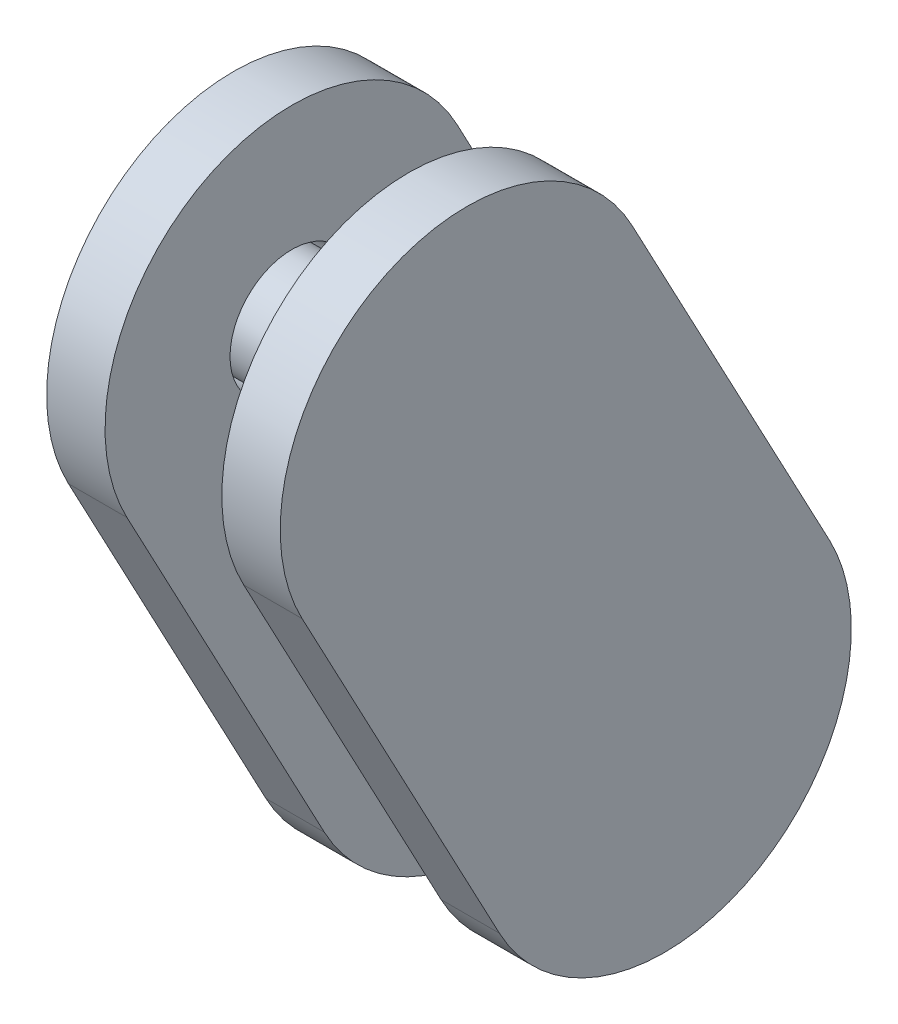
ISO-10303-21;
HEADER;
FILE_DESCRIPTION(('STEP AP214'),'2;1');
FILE_NAME('part.step','',(''),(''),'','','');
FILE_SCHEMA(('AUTOMOTIVE_DESIGN { 1 0 10303 214 1 1 1 1 }'));
ENDSEC;
DATA;
#1=APPLICATION_CONTEXT('core data for automotive mechanical design processes');
#2=APPLICATION_PROTOCOL_DEFINITION('international standard','automotive_design',2000,#1);
#3=PRODUCT_CONTEXT('',#1,'mechanical');
#4=PRODUCT('Part','Part','',(#3));
#5=PRODUCT_RELATED_PRODUCT_CATEGORY('part','',(#4));
#6=PRODUCT_DEFINITION_FORMATION('','',#4);
#7=PRODUCT_DEFINITION_CONTEXT('part definition',#1,'design');
#8=PRODUCT_DEFINITION('design','',#6,#7);
#9=PRODUCT_DEFINITION_SHAPE('','',#8);
#10=(LENGTH_UNIT() NAMED_UNIT(*) SI_UNIT(.MILLI.,.METRE.));
#11=(NAMED_UNIT(*) PLANE_ANGLE_UNIT() SI_UNIT($,.RADIAN.));
#12=(NAMED_UNIT(*) SI_UNIT($,.STERADIAN.) SOLID_ANGLE_UNIT());
#13=UNCERTAINTY_MEASURE_WITH_UNIT(LENGTH_MEASURE(1.E-05),#10,'distance_accuracy_value','');
#14=(GEOMETRIC_REPRESENTATION_CONTEXT(3) GLOBAL_UNCERTAINTY_ASSIGNED_CONTEXT((#13)) GLOBAL_UNIT_ASSIGNED_CONTEXT((#10,
#11,#12)) REPRESENTATION_CONTEXT('',''));
#15=CARTESIAN_POINT('',(0.,0.,0.));
#16=DIRECTION('',(0.,0.,1.));
#17=DIRECTION('',(1.,0.,0.));
#18=AXIS2_PLACEMENT_3D('',#15,#16,#17);
#19=CARTESIAN_POINT('',(-4.99519052838327,0.00127383187920049,-0.00381532333161745));
#20=DIRECTION('',(-1.,0.,0.));
#21=DIRECTION('',(0.,0.,1.));
#22=AXIS2_PLACEMENT_3D('',#19,#20,#21);
#23=PLANE('',#22);
#24=CARTESIAN_POINT('',(-4.99519052838327,0.00127383187920049,-0.00381532333161745));
#25=DIRECTION('',(-1.,0.,0.));
#26=DIRECTION('',(0.,0.,1.));
#27=AXIS2_PLACEMENT_3D('',#24,#25,#26);
#28=CIRCLE('',#27,2.65);
#29=CARTESIAN_POINT('',(-4.99519052838327,0.00127383187920049,2.64618467666838));
#30=VERTEX_POINT('',#29);
#31=EDGE_CURVE('E115',#30,#30,#28,.T.);
#32=ORIENTED_EDGE('',*,*,#31,.F.);
#33=EDGE_LOOP('',(#32));
#34=FACE_BOUND('',#33,.T.);
#35=CARTESIAN_POINT('',(-4.99519052838327,0.00127383187920049,-0.00381532333161745));
#36=DIRECTION('',(-1.,0.,0.));
#37=DIRECTION('',(0.,0.,1.));
#38=AXIS2_PLACEMENT_3D('',#35,#36,#37);
#39=CIRCLE('',#38,8.00000000000001);
#40=CARTESIAN_POINT('',(-4.99519052838327,-3.75449867040795,7.05976541953981));
#41=VERTEX_POINT('',#40);
#42=CARTESIAN_POINT('',(-4.99519052838327,3.75704633416633,-7.06739606620305));
#43=VERTEX_POINT('',#42);
#44=EDGE_CURVE('E100',#41,#43,#39,.T.);
#45=ORIENTED_EDGE('',*,*,#44,.T.);
#46=DIRECTION('',(0.,-0.882947592858927,-0.469471562785891));
#47=VECTOR('',#46,1.);
#48=CARTESIAN_POINT('',(-4.99519052838327,3.75704633416633,-7.06739606620305));
#49=LINE('',#48,#47);
#50=CARTESIAN_POINT('',(-4.99519052838327,-12.1360103372943,-15.5178841963491));
#51=VERTEX_POINT('',#50);
#52=EDGE_CURVE('E95',#43,#51,#49,.T.);
#53=ORIENTED_EDGE('',*,*,#52,.T.);
#54=CARTESIAN_POINT('',(-4.99519052838327,-15.8917828395815,-8.45430345347767));
#55=DIRECTION('',(-1.,0.,0.));
#56=DIRECTION('',(0.,0.,1.));
#57=AXIS2_PLACEMENT_3D('',#54,#55,#56);
#58=CIRCLE('',#57,8.00000000000001);
#59=CARTESIAN_POINT('',(-4.99519052838327,-19.6475553418686,-1.39072271060625));
#60=VERTEX_POINT('',#59);
#61=EDGE_CURVE('E98',#51,#60,#58,.T.);
#62=ORIENTED_EDGE('',*,*,#61,.T.);
#63=DIRECTION('',(0.,0.882947592858926,0.469471562785892));
#64=VECTOR('',#63,1.);
#65=CARTESIAN_POINT('',(-4.99519052838327,-19.6475553418686,-1.39072271060625));
#66=LINE('',#65,#64);
#67=EDGE_CURVE('E65',#60,#41,#66,.T.);
#68=ORIENTED_EDGE('',*,*,#67,.T.);
#69=EDGE_LOOP('',(#45,#53,#62,#68));
#70=FACE_BOUND('',#69,.T.);
#71=CARTESIAN_POINT('',(-4.99519052838327,-15.8917828395815,-8.45430345347767));
#72=DIRECTION('',(-1.,0.,0.));
#73=DIRECTION('',(0.,0.,1.));
#74=AXIS2_PLACEMENT_3D('',#71,#72,#73);
#75=CIRCLE('',#74,2.65);
#76=CARTESIAN_POINT('',(-4.99519052838327,-15.8917828395815,-5.80430345347767));
#77=VERTEX_POINT('',#76);
#78=EDGE_CURVE('E130',#77,#77,#75,.T.);
#79=ORIENTED_EDGE('',*,*,#78,.F.);
#80=EDGE_LOOP('',(#79));
#81=FACE_BOUND('',#80,.T.);
#82=ADVANCED_FACE('F48',(#34,#70,#81),#23,.T.);
#83=CARTESIAN_POINT('',(-2.49519052838327,0.00127383187920049,-0.00381532333161745));
#84=DIRECTION('',(-1.,0.,0.));
#85=DIRECTION('',(0.,0.,1.));
#86=AXIS2_PLACEMENT_3D('',#83,#84,#85);
#87=PLANE('',#86);
#88=CARTESIAN_POINT('',(-2.49519052838327,0.00127383187920049,-0.00381532333161745));
#89=DIRECTION('',(-1.,0.,0.));
#90=DIRECTION('',(0.,0.,1.));
#91=AXIS2_PLACEMENT_3D('',#88,#89,#90);
#92=CIRCLE('',#91,8.00000000000001);
#93=CARTESIAN_POINT('',(-2.49519052838327,-3.75449867040795,7.05976541953981));
#94=VERTEX_POINT('',#93);
#95=CARTESIAN_POINT('',(-2.49519052838327,3.75704633416633,-7.06739606620305));
#96=VERTEX_POINT('',#95);
#97=EDGE_CURVE('E112',#94,#96,#92,.T.);
#98=ORIENTED_EDGE('',*,*,#97,.F.);
#99=DIRECTION('',(0.,0.882947592858926,0.469471562785892));
#100=VECTOR('',#99,1.);
#101=CARTESIAN_POINT('',(-2.49519052838327,-19.6475553418686,-1.39072271060625));
#102=LINE('',#101,#100);
#103=CARTESIAN_POINT('',(-2.49519052838327,-19.6475553418686,-1.39072271060625));
#104=VERTEX_POINT('',#103);
#105=EDGE_CURVE('E88',#104,#94,#102,.T.);
#106=ORIENTED_EDGE('',*,*,#105,.F.);
#107=CARTESIAN_POINT('',(-2.49519052838327,-15.8917828395815,-8.45430345347767));
#108=DIRECTION('',(-1.,0.,0.));
#109=DIRECTION('',(0.,0.,1.));
#110=AXIS2_PLACEMENT_3D('',#107,#108,#109);
#111=CIRCLE('',#110,8.00000000000001);
#112=CARTESIAN_POINT('',(-2.49519052838327,-12.1360103372943,-15.5178841963491));
#113=VERTEX_POINT('',#112);
#114=EDGE_CURVE('E82',#113,#104,#111,.T.);
#115=ORIENTED_EDGE('',*,*,#114,.F.);
#116=DIRECTION('',(0.,-0.882947592858927,-0.469471562785891));
#117=VECTOR('',#116,1.);
#118=CARTESIAN_POINT('',(-2.49519052838327,3.75704633416633,-7.06739606620305));
#119=LINE('',#118,#117);
#120=EDGE_CURVE('E104',#96,#113,#119,.T.);
#121=ORIENTED_EDGE('',*,*,#120,.F.);
#122=EDGE_LOOP('',(#98,#106,#115,#121));
#123=FACE_BOUND('',#122,.T.);
#124=CARTESIAN_POINT('',(-2.49519052838327,0.00127383187920049,-0.00381532333161745));
#125=DIRECTION('',(-1.,0.,0.));
#126=DIRECTION('',(0.,0.,1.));
#127=AXIS2_PLACEMENT_3D('',#124,#125,#126);
#128=CIRCLE('',#127,2.65);
#129=CARTESIAN_POINT('',(-2.49519052838327,0.00127383187920049,2.64618467666838));
#130=VERTEX_POINT('',#129);
#131=EDGE_CURVE('E127',#130,#130,#128,.T.);
#132=ORIENTED_EDGE('',*,*,#131,.T.);
#133=EDGE_LOOP('',(#132));
#134=FACE_BOUND('',#133,.T.);
#135=CARTESIAN_POINT('',(-2.49519052838327,-15.8917828395815,-8.45430345347767));
#136=DIRECTION('',(-1.,0.,0.));
#137=DIRECTION('',(0.,0.,1.));
#138=AXIS2_PLACEMENT_3D('',#135,#136,#137);
#139=CIRCLE('',#138,2.65);
#140=CARTESIAN_POINT('',(-2.49519052838327,-15.8917828395815,-5.80430345347767));
#141=VERTEX_POINT('',#140);
#142=EDGE_CURVE('E133',#141,#141,#139,.T.);
#143=ORIENTED_EDGE('',*,*,#142,.T.);
#144=EDGE_LOOP('',(#143));
#145=FACE_BOUND('',#144,.T.);
#146=ADVANCED_FACE('F123',(#123,#134,#145),#87,.F.);
#147=CARTESIAN_POINT('',(-4.99519052838327,0.00127383187920049,-0.00381532333161745));
#148=DIRECTION('',(1.,0.,0.));
#149=DIRECTION('',(0.,0.,-1.));
#150=AXIS2_PLACEMENT_3D('',#147,#148,#149);
#151=CYLINDRICAL_SURFACE('',#150,8.00000000000001);
#152=ORIENTED_EDGE('',*,*,#97,.T.);
#153=DIRECTION('',(1.,0.,0.));
#154=VECTOR('',#153,1.);
#155=CARTESIAN_POINT('',(-4.99519052838327,3.75704633416633,-7.06739606620305));
#156=LINE('',#155,#154);
#157=EDGE_CURVE('E12',#43,#96,#156,.T.);
#158=ORIENTED_EDGE('',*,*,#157,.F.);
#159=ORIENTED_EDGE('',*,*,#44,.F.);
#160=DIRECTION('',(1.,0.,0.));
#161=VECTOR('',#160,1.);
#162=CARTESIAN_POINT('',(-4.99519052838327,-3.75449867040795,7.05976541953981));
#163=LINE('',#162,#161);
#164=EDGE_CURVE('E108',#41,#94,#163,.T.);
#165=ORIENTED_EDGE('',*,*,#164,.T.);
#166=EDGE_LOOP('',(#152,#158,#159,#165));
#167=FACE_BOUND('',#166,.T.);
#168=ADVANCED_FACE('F50',(#167),#151,.T.);
#169=CARTESIAN_POINT('',(-4.99519052838327,3.75704633416633,-7.06739606620305));
#170=DIRECTION('',(0.,-0.469471562785891,0.882947592858927));
#171=DIRECTION('',(0.,-0.882947592858927,-0.469471562785891));
#172=AXIS2_PLACEMENT_3D('',#169,#170,#171);
#173=PLANE('',#172);
#174=ORIENTED_EDGE('',*,*,#120,.T.);
#175=DIRECTION('',(1.,0.,0.));
#176=VECTOR('',#175,1.);
#177=CARTESIAN_POINT('',(-4.99519052838327,-12.1360103372943,-15.5178841963491));
#178=LINE('',#177,#176);
#179=EDGE_CURVE('E57',#51,#113,#178,.T.);
#180=ORIENTED_EDGE('',*,*,#179,.F.);
#181=ORIENTED_EDGE('',*,*,#52,.F.);
#182=ORIENTED_EDGE('',*,*,#157,.T.);
#183=EDGE_LOOP('',(#174,#180,#181,#182));
#184=FACE_BOUND('',#183,.T.);
#185=ADVANCED_FACE('F103',(#184),#173,.F.);
#186=CARTESIAN_POINT('',(-4.99519052838327,-15.8917828395815,-8.45430345347767));
#187=DIRECTION('',(1.,0.,0.));
#188=DIRECTION('',(0.,0.,-1.));
#189=AXIS2_PLACEMENT_3D('',#186,#187,#188);
#190=CYLINDRICAL_SURFACE('',#189,8.00000000000001);
#191=ORIENTED_EDGE('',*,*,#114,.T.);
#192=DIRECTION('',(1.,0.,0.));
#193=VECTOR('',#192,1.);
#194=CARTESIAN_POINT('',(-4.99519052838327,-19.6475553418686,-1.39072271060625));
#195=LINE('',#194,#193);
#196=EDGE_CURVE('E105',#60,#104,#195,.T.);
#197=ORIENTED_EDGE('',*,*,#196,.F.);
#198=ORIENTED_EDGE('',*,*,#61,.F.);
#199=ORIENTED_EDGE('',*,*,#179,.T.);
#200=EDGE_LOOP('',(#191,#197,#198,#199));
#201=FACE_BOUND('',#200,.T.);
#202=ADVANCED_FACE('F106',(#201),#190,.T.);
#203=CARTESIAN_POINT('',(-4.99519052838327,-19.6475553418686,-1.39072271060625));
#204=DIRECTION('',(0.,0.469471562785892,-0.882947592858926));
#205=DIRECTION('',(0.,0.882947592858926,0.469471562785892));
#206=AXIS2_PLACEMENT_3D('',#203,#204,#205);
#207=PLANE('',#206);
#208=ORIENTED_EDGE('',*,*,#105,.T.);
#209=ORIENTED_EDGE('',*,*,#164,.F.);
#210=ORIENTED_EDGE('',*,*,#67,.F.);
#211=ORIENTED_EDGE('',*,*,#196,.T.);
#212=EDGE_LOOP('',(#208,#209,#210,#211));
#213=FACE_BOUND('',#212,.T.);
#214=ADVANCED_FACE('F120',(#213),#207,.F.);
#215=CARTESIAN_POINT('',(-4.99519052838327,0.00127383187920049,-0.00381532333161745));
#216=DIRECTION('',(1.,0.,0.));
#217=DIRECTION('',(0.,0.,-1.));
#218=AXIS2_PLACEMENT_3D('',#215,#216,#217);
#219=CYLINDRICAL_SURFACE('',#218,2.65);
#220=ORIENTED_EDGE('',*,*,#31,.T.);
#221=EDGE_LOOP('',(#220));
#222=FACE_BOUND('',#221,.T.);
#223=ORIENTED_EDGE('',*,*,#131,.F.);
#224=EDGE_LOOP('',(#223));
#225=FACE_BOUND('',#224,.T.);
#226=ADVANCED_FACE('F150',(#222,#225),#219,.F.);
#227=CARTESIAN_POINT('',(-4.99519052838327,-15.8917828395815,-8.45430345347767));
#228=DIRECTION('',(1.,0.,0.));
#229=DIRECTION('',(0.,0.,-1.));
#230=AXIS2_PLACEMENT_3D('',#227,#228,#229);
#231=CYLINDRICAL_SURFACE('',#230,2.65);
#232=ORIENTED_EDGE('',*,*,#78,.T.);
#233=EDGE_LOOP('',(#232));
#234=FACE_BOUND('',#233,.T.);
#235=ORIENTED_EDGE('',*,*,#142,.F.);
#236=EDGE_LOOP('',(#235));
#237=FACE_BOUND('',#236,.T.);
#238=ADVANCED_FACE('F139',(#234,#237),#231,.F.);
#239=CLOSED_SHELL('',(#82,#146,#168,#185,#202,#214,#226,#238));
#240=MANIFOLD_SOLID_BREP('B2',#239);
#241=CARTESIAN_POINT('',(5.00480947161673,0.00127383187920049,-0.00381532333161745));
#242=DIRECTION('',(-1.,0.,0.));
#243=DIRECTION('',(0.,0.,1.));
#244=AXIS2_PLACEMENT_3D('',#241,#242,#243);
#245=CYLINDRICAL_SURFACE('',#244,8.00000000000001);
#246=CARTESIAN_POINT('',(2.50480947161673,0.00127383187920049,-0.00381532333161745));
#247=DIRECTION('',(1.,0.,0.));
#248=DIRECTION('',(0.,0.,-1.));
#249=AXIS2_PLACEMENT_3D('',#246,#247,#248);
#250=CIRCLE('',#249,8.00000000000001);
#251=CARTESIAN_POINT('',(2.50480947161673,3.75704633416633,-7.06739606620304));
#252=VERTEX_POINT('',#251);
#253=CARTESIAN_POINT('',(2.50480947161673,-3.75449867040795,7.0597654195398));
#254=VERTEX_POINT('',#253);
#255=EDGE_CURVE('E285',#252,#254,#250,.T.);
#256=ORIENTED_EDGE('',*,*,#255,.T.);
#257=DIRECTION('',(-1.,0.,0.));
#258=VECTOR('',#257,1.);
#259=CARTESIAN_POINT('',(5.00480947161673,-3.75449867040795,7.0597654195398));
#260=LINE('',#259,#258);
#261=CARTESIAN_POINT('',(5.00480947161673,-3.75449867040795,7.0597654195398));
#262=VERTEX_POINT('',#261);
#263=EDGE_CURVE('E274',#262,#254,#260,.T.);
#264=ORIENTED_EDGE('',*,*,#263,.F.);
#265=CARTESIAN_POINT('',(5.00480947161673,0.00127383187920049,-0.00381532333161745));
#266=DIRECTION('',(1.,0.,0.));
#267=DIRECTION('',(0.,0.,-1.));
#268=AXIS2_PLACEMENT_3D('',#265,#266,#267);
#269=CIRCLE('',#268,8.00000000000001);
#270=CARTESIAN_POINT('',(5.00480947161673,3.75704633416633,-7.06739606620304));
#271=VERTEX_POINT('',#270);
#272=EDGE_CURVE('E266',#271,#262,#269,.T.);
#273=ORIENTED_EDGE('',*,*,#272,.F.);
#274=DIRECTION('',(-1.,0.,0.));
#275=VECTOR('',#274,1.);
#276=CARTESIAN_POINT('',(5.00480947161673,3.75704633416633,-7.06739606620304));
#277=LINE('',#276,#275);
#278=EDGE_CURVE('E281',#271,#252,#277,.T.);
#279=ORIENTED_EDGE('',*,*,#278,.T.);
#280=EDGE_LOOP('',(#256,#264,#273,#279));
#281=FACE_BOUND('',#280,.T.);
#282=ADVANCED_FACE('F213',(#281),#245,.T.);
#283=CARTESIAN_POINT('',(5.00480947161673,-3.75449867040795,7.0597654195398));
#284=DIRECTION('',(0.,0.469471562785892,-0.882947592858927));
#285=DIRECTION('',(0.,0.882947592858927,0.469471562785892));
#286=AXIS2_PLACEMENT_3D('',#283,#284,#285);
#287=PLANE('',#286);
#288=DIRECTION('',(0.,-0.882947592858926,-0.469471562785892));
#289=VECTOR('',#288,1.);
#290=CARTESIAN_POINT('',(2.50480947161673,-3.75449867040795,7.0597654195398));
#291=LINE('',#290,#289);
#292=CARTESIAN_POINT('',(2.50480947161673,-19.6475553418686,-1.39072271060625));
#293=VERTEX_POINT('',#292);
#294=EDGE_CURVE('E272',#254,#293,#291,.T.);
#295=ORIENTED_EDGE('',*,*,#294,.T.);
#296=DIRECTION('',(-1.,0.,0.));
#297=VECTOR('',#296,1.);
#298=CARTESIAN_POINT('',(5.00480947161673,-19.6475553418686,-1.39072271060625));
#299=LINE('',#298,#297);
#300=CARTESIAN_POINT('',(5.00480947161673,-19.6475553418686,-1.39072271060625));
#301=VERTEX_POINT('',#300);
#302=EDGE_CURVE('E270',#301,#293,#299,.T.);
#303=ORIENTED_EDGE('',*,*,#302,.F.);
#304=DIRECTION('',(0.,-0.882947592858926,-0.469471562785892));
#305=VECTOR('',#304,1.);
#306=CARTESIAN_POINT('',(5.00480947161673,-3.75449867040795,7.0597654195398));
#307=LINE('',#306,#305);
#308=EDGE_CURVE('E261',#262,#301,#307,.T.);
#309=ORIENTED_EDGE('',*,*,#308,.F.);
#310=ORIENTED_EDGE('',*,*,#263,.T.);
#311=EDGE_LOOP('',(#295,#303,#309,#310));
#312=FACE_BOUND('',#311,.T.);
#313=ADVANCED_FACE('F271',(#312),#287,.F.);
#314=CARTESIAN_POINT('',(5.00480947161673,-15.8917828395815,-8.45430345347767));
#315=DIRECTION('',(-1.,0.,0.));
#316=DIRECTION('',(0.,0.,1.));
#317=AXIS2_PLACEMENT_3D('',#314,#315,#316);
#318=CYLINDRICAL_SURFACE('',#317,8.00000000000001);
#319=CARTESIAN_POINT('',(2.50480947161673,-15.8917828395815,-8.45430345347767));
#320=DIRECTION('',(1.,0.,0.));
#321=DIRECTION('',(0.,0.,-1.));
#322=AXIS2_PLACEMENT_3D('',#319,#320,#321);
#323=CIRCLE('',#322,8.00000000000001);
#324=CARTESIAN_POINT('',(2.50480947161673,-12.1360103372943,-15.5178841963491));
#325=VERTEX_POINT('',#324);
#326=EDGE_CURVE('E247',#293,#325,#323,.T.);
#327=ORIENTED_EDGE('',*,*,#326,.T.);
#328=DIRECTION('',(-1.,0.,0.));
#329=VECTOR('',#328,1.);
#330=CARTESIAN_POINT('',(5.00480947161673,-12.1360103372943,-15.5178841963491));
#331=LINE('',#330,#329);
#332=CARTESIAN_POINT('',(5.00480947161673,-12.1360103372943,-15.5178841963491));
#333=VERTEX_POINT('',#332);
#334=EDGE_CURVE('E275',#333,#325,#331,.T.);
#335=ORIENTED_EDGE('',*,*,#334,.F.);
#336=CARTESIAN_POINT('',(5.00480947161673,-15.8917828395815,-8.45430345347767));
#337=DIRECTION('',(1.,0.,0.));
#338=DIRECTION('',(0.,0.,-1.));
#339=AXIS2_PLACEMENT_3D('',#336,#337,#338);
#340=CIRCLE('',#339,8.00000000000001);
#341=EDGE_CURVE('E264',#301,#333,#340,.T.);
#342=ORIENTED_EDGE('',*,*,#341,.F.);
#343=ORIENTED_EDGE('',*,*,#302,.T.);
#344=EDGE_LOOP('',(#327,#335,#342,#343));
#345=FACE_BOUND('',#344,.T.);
#346=ADVANCED_FACE('F277',(#345),#318,.T.);
#347=CARTESIAN_POINT('',(5.00480947161673,3.75704633416633,-7.06739606620304));
#348=DIRECTION('',(0.,-0.469471562785891,0.882947592858927));
#349=DIRECTION('',(0.,-0.882947592858927,-0.469471562785891));
#350=AXIS2_PLACEMENT_3D('',#347,#348,#349);
#351=PLANE('',#350);
#352=DIRECTION('',(0.,0.882947592858927,0.469471562785891));
#353=VECTOR('',#352,1.);
#354=CARTESIAN_POINT('',(2.50480947161673,3.75704633416633,-7.06739606620304));
#355=LINE('',#354,#353);
#356=EDGE_CURVE('E253',#325,#252,#355,.T.);
#357=ORIENTED_EDGE('',*,*,#356,.T.);
#358=ORIENTED_EDGE('',*,*,#278,.F.);
#359=DIRECTION('',(0.,0.882947592858927,0.469471562785891));
#360=VECTOR('',#359,1.);
#361=CARTESIAN_POINT('',(5.00480947161673,3.75704633416633,-7.06739606620304));
#362=LINE('',#361,#360);
#363=EDGE_CURVE('E230',#333,#271,#362,.T.);
#364=ORIENTED_EDGE('',*,*,#363,.F.);
#365=ORIENTED_EDGE('',*,*,#334,.T.);
#366=EDGE_LOOP('',(#357,#358,#364,#365));
#367=FACE_BOUND('',#366,.T.);
#368=ADVANCED_FACE('F314',(#367),#351,.F.);
#369=CARTESIAN_POINT('',(5.00480947161673,0.00127383187920049,-0.00381532333161745));
#370=DIRECTION('',(1.,0.,0.));
#371=DIRECTION('',(0.,0.,-1.));
#372=AXIS2_PLACEMENT_3D('',#369,#370,#371);
#373=PLANE('',#372);
#374=ORIENTED_EDGE('',*,*,#272,.T.);
#375=ORIENTED_EDGE('',*,*,#308,.T.);
#376=ORIENTED_EDGE('',*,*,#341,.T.);
#377=ORIENTED_EDGE('',*,*,#363,.T.);
#378=EDGE_LOOP('',(#374,#375,#376,#377));
#379=FACE_BOUND('',#378,.T.);
#380=ADVANCED_FACE('F262',(#379),#373,.T.);
#381=CARTESIAN_POINT('',(2.50480947161673,0.00127383187920049,-0.00381532333161745));
#382=DIRECTION('',(1.,0.,0.));
#383=DIRECTION('',(0.,0.,-1.));
#384=AXIS2_PLACEMENT_3D('',#381,#382,#383);
#385=PLANE('',#384);
#386=CARTESIAN_POINT('',(2.50480947161673,0.00127383187920049,-0.00381532333161745));
#387=DIRECTION('',(1.,0.,0.));
#388=DIRECTION('',(0.,0.,-1.));
#389=AXIS2_PLACEMENT_3D('',#386,#387,#388);
#390=CIRCLE('',#389,2.35);
#391=CARTESIAN_POINT('',(2.50480947161673,0.00127383187920049,-2.35381532333162));
#392=VERTEX_POINT('',#391);
#393=EDGE_CURVE('E46',#392,#392,#390,.F.);
#394=ORIENTED_EDGE('',*,*,#393,.F.);
#395=EDGE_LOOP('',(#394));
#396=FACE_BOUND('',#395,.T.);
#397=CARTESIAN_POINT('',(2.50480947161673,-15.8917828395815,-8.45430345347767));
#398=DIRECTION('',(1.,0.,0.));
#399=DIRECTION('',(0.,0.,-1.));
#400=AXIS2_PLACEMENT_3D('',#397,#398,#399);
#401=CIRCLE('',#400,2.35);
#402=CARTESIAN_POINT('',(2.50480947161673,-15.8917828395815,-10.8043034534777));
#403=VERTEX_POINT('',#402);
#404=EDGE_CURVE('E222',#403,#403,#401,.F.);
#405=ORIENTED_EDGE('',*,*,#404,.F.);
#406=EDGE_LOOP('',(#405));
#407=FACE_BOUND('',#406,.T.);
#408=ORIENTED_EDGE('',*,*,#255,.F.);
#409=ORIENTED_EDGE('',*,*,#356,.F.);
#410=ORIENTED_EDGE('',*,*,#326,.F.);
#411=ORIENTED_EDGE('',*,*,#294,.F.);
#412=EDGE_LOOP('',(#408,#409,#410,#411));
#413=FACE_BOUND('',#412,.T.);
#414=ADVANCED_FACE('F307',(#396,#407,#413),#385,.F.);
#415=CARTESIAN_POINT('',(-4.99519052838327,-15.8917828395815,-8.45430345347767));
#416=DIRECTION('',(1.,0.,0.));
#417=DIRECTION('',(0.,0.,-1.));
#418=AXIS2_PLACEMENT_3D('',#415,#416,#417);
#419=CYLINDRICAL_SURFACE('',#418,2.35);
#420=CARTESIAN_POINT('',(-4.99519052838327,-15.8917828395815,-8.45430345347767));
#421=DIRECTION('',(-1.,0.,0.));
#422=DIRECTION('',(0.,0.,1.));
#423=AXIS2_PLACEMENT_3D('',#420,#421,#422);
#424=CIRCLE('',#423,2.35);
#425=CARTESIAN_POINT('',(-4.99519052838327,-15.8917828395815,-6.10430345347767));
#426=VERTEX_POINT('',#425);
#427=EDGE_CURVE('E289',#426,#426,#424,.T.);
#428=ORIENTED_EDGE('',*,*,#427,.F.);
#429=EDGE_LOOP('',(#428));
#430=FACE_BOUND('',#429,.T.);
#431=ORIENTED_EDGE('',*,*,#404,.T.);
#432=EDGE_LOOP('',(#431));
#433=FACE_BOUND('',#432,.T.);
#434=ADVANCED_FACE('F305',(#430,#433),#419,.T.);
#435=CARTESIAN_POINT('',(-4.99519052838327,-15.8917828395815,-8.45430345347767));
#436=DIRECTION('',(-1.,0.,0.));
#437=DIRECTION('',(0.,0.,1.));
#438=AXIS2_PLACEMENT_3D('',#435,#436,#437);
#439=PLANE('',#438);
#440=ORIENTED_EDGE('',*,*,#427,.T.);
#441=EDGE_LOOP('',(#440));
#442=FACE_BOUND('',#441,.T.);
#443=ADVANCED_FACE('F359',(#442),#439,.T.);
#444=CARTESIAN_POINT('',(-4.99519052838327,0.00127383187920049,-0.00381532333161745));
#445=DIRECTION('',(1.,0.,0.));
#446=DIRECTION('',(0.,0.,-1.));
#447=AXIS2_PLACEMENT_3D('',#444,#445,#446);
#448=CYLINDRICAL_SURFACE('',#447,2.35);
#449=CARTESIAN_POINT('',(-4.99519052838327,0.00127383187920049,-0.00381532333161745));
#450=DIRECTION('',(-1.,0.,0.));
#451=DIRECTION('',(0.,0.,1.));
#452=AXIS2_PLACEMENT_3D('',#449,#450,#451);
#453=CIRCLE('',#452,2.35);
#454=CARTESIAN_POINT('',(-4.99519052838327,0.00127383187920049,2.34618467666838));
#455=VERTEX_POINT('',#454);
#456=EDGE_CURVE('E395',#455,#455,#453,.T.);
#457=ORIENTED_EDGE('',*,*,#456,.F.);
#458=EDGE_LOOP('',(#457));
#459=FACE_BOUND('',#458,.T.);
#460=ORIENTED_EDGE('',*,*,#393,.T.);
#461=EDGE_LOOP('',(#460));
#462=FACE_BOUND('',#461,.T.);
#463=ADVANCED_FACE('F369',(#459,#462),#448,.T.);
#464=CARTESIAN_POINT('',(-4.99519052838327,0.00127383187920049,-0.00381532333161745));
#465=DIRECTION('',(-1.,0.,0.));
#466=DIRECTION('',(0.,0.,1.));
#467=AXIS2_PLACEMENT_3D('',#464,#465,#466);
#468=PLANE('',#467);
#469=ORIENTED_EDGE('',*,*,#456,.T.);
#470=EDGE_LOOP('',(#469));
#471=FACE_BOUND('',#470,.T.);
#472=ADVANCED_FACE('F379',(#471),#468,.T.);
#473=CLOSED_SHELL('',(#282,#313,#346,#368,#380,#414,#434,#443,#463,#472));
#474=MANIFOLD_SOLID_BREP('B6',#473);
#475=ADVANCED_BREP_SHAPE_REPRESENTATION('',(#18,#240,#474),#14);
#476=SHAPE_DEFINITION_REPRESENTATION(#9,#475);
ENDSEC;
END-ISO-10303-21;
